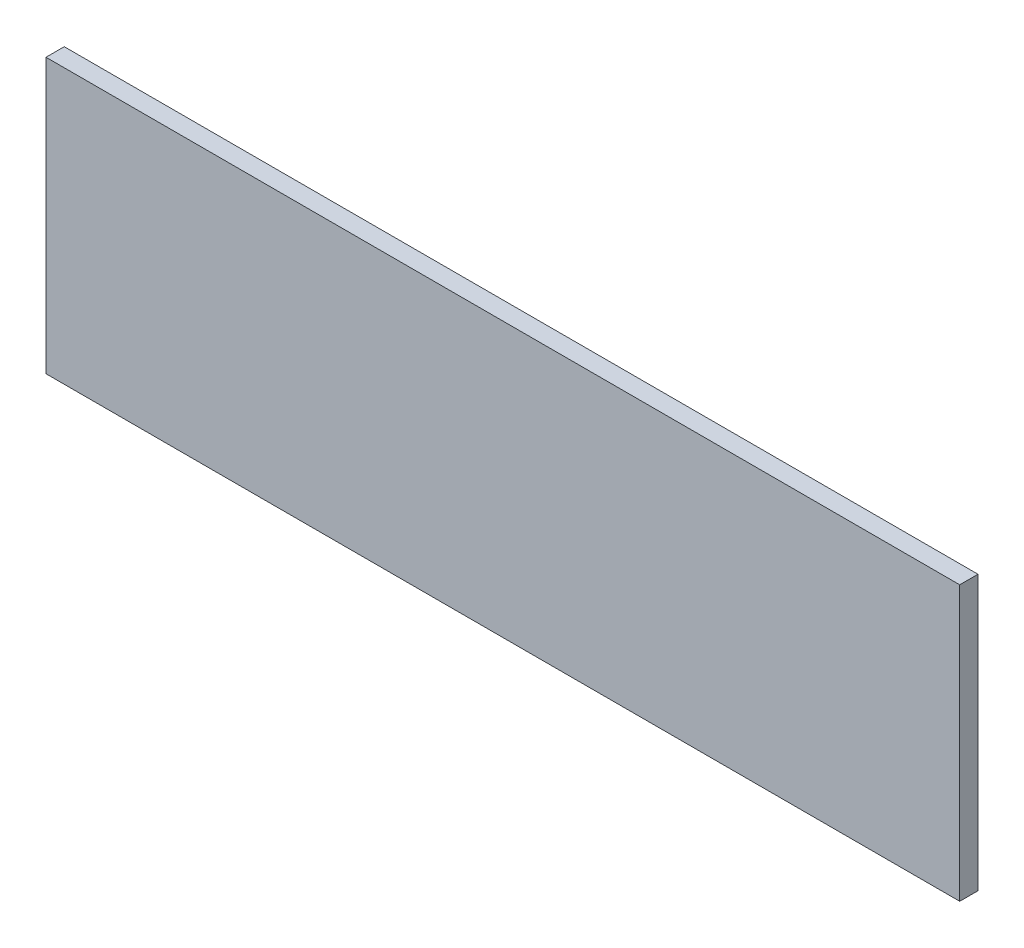
ISO-10303-21;
HEADER;
FILE_DESCRIPTION(('STEP AP214'),'2;1');
FILE_NAME('part.step','',(''),(''),'','','');
FILE_SCHEMA(('AUTOMOTIVE_DESIGN { 1 0 10303 214 1 1 1 1 }'));
ENDSEC;
DATA;
#1=APPLICATION_CONTEXT('core data for automotive mechanical design processes');
#2=APPLICATION_PROTOCOL_DEFINITION('international standard','automotive_design',2000,#1);
#3=PRODUCT_CONTEXT('',#1,'mechanical');
#4=PRODUCT('Part','Part','',(#3));
#5=PRODUCT_RELATED_PRODUCT_CATEGORY('part','',(#4));
#6=PRODUCT_DEFINITION_FORMATION('','',#4);
#7=PRODUCT_DEFINITION_CONTEXT('part definition',#1,'design');
#8=PRODUCT_DEFINITION('design','',#6,#7);
#9=PRODUCT_DEFINITION_SHAPE('','',#8);
#10=(LENGTH_UNIT() NAMED_UNIT(*) SI_UNIT(.MILLI.,.METRE.));
#11=(NAMED_UNIT(*) PLANE_ANGLE_UNIT() SI_UNIT($,.RADIAN.));
#12=(NAMED_UNIT(*) SI_UNIT($,.STERADIAN.) SOLID_ANGLE_UNIT());
#13=UNCERTAINTY_MEASURE_WITH_UNIT(LENGTH_MEASURE(1.E-05),#10,'distance_accuracy_value','');
#14=(GEOMETRIC_REPRESENTATION_CONTEXT(3) GLOBAL_UNCERTAINTY_ASSIGNED_CONTEXT((#13)) GLOBAL_UNIT_ASSIGNED_CONTEXT((#10,
#11,#12)) REPRESENTATION_CONTEXT('',''));
#15=CARTESIAN_POINT('',(0.,0.,0.));
#16=DIRECTION('',(0.,0.,1.));
#17=DIRECTION('',(1.,0.,0.));
#18=AXIS2_PLACEMENT_3D('',#15,#16,#17);
#19=CARTESIAN_POINT('',(-177.979274611399,94.041450777202,10.));
#20=DIRECTION('',(1.,0.,0.));
#21=DIRECTION('',(0.,0.,-1.));
#22=AXIS2_PLACEMENT_3D('',#19,#20,#21);
#23=PLANE('',#22);
#24=DIRECTION('',(0.,-1.,0.));
#25=VECTOR('',#24,1.);
#26=CARTESIAN_POINT('',(-177.979274611399,94.041450777202,0.));
#27=LINE('',#26,#25);
#28=CARTESIAN_POINT('',(-177.979274611399,94.041450777202,0.));
#29=VERTEX_POINT('',#28);
#30=CARTESIAN_POINT('',(-177.979274611399,-55.9585492227979,0.));
#31=VERTEX_POINT('',#30);
#32=EDGE_CURVE('E99',#29,#31,#27,.T.);
#33=ORIENTED_EDGE('',*,*,#32,.T.);
#34=DIRECTION('',(0.,0.,-1.));
#35=VECTOR('',#34,1.);
#36=CARTESIAN_POINT('',(-177.979274611399,-55.9585492227979,10.));
#37=LINE('',#36,#35);
#38=CARTESIAN_POINT('',(-177.979274611399,-55.9585492227979,10.));
#39=VERTEX_POINT('',#38);
#40=EDGE_CURVE('E11',#39,#31,#37,.T.);
#41=ORIENTED_EDGE('',*,*,#40,.F.);
#42=DIRECTION('',(0.,-1.,0.));
#43=VECTOR('',#42,1.);
#44=CARTESIAN_POINT('',(-177.979274611399,94.041450777202,10.));
#45=LINE('',#44,#43);
#46=CARTESIAN_POINT('',(-177.979274611399,94.041450777202,10.));
#47=VERTEX_POINT('',#46);
#48=EDGE_CURVE('E87',#47,#39,#45,.T.);
#49=ORIENTED_EDGE('',*,*,#48,.F.);
#50=DIRECTION('',(0.,0.,-1.));
#51=VECTOR('',#50,1.);
#52=CARTESIAN_POINT('',(-177.979274611399,94.041450777202,10.));
#53=LINE('',#52,#51);
#54=EDGE_CURVE('E95',#47,#29,#53,.T.);
#55=ORIENTED_EDGE('',*,*,#54,.T.);
#56=EDGE_LOOP('',(#33,#41,#49,#55));
#57=FACE_BOUND('',#56,.T.);
#58=ADVANCED_FACE('F36',(#57),#23,.F.);
#59=CARTESIAN_POINT('',(-177.979274611399,-55.9585492227979,10.));
#60=DIRECTION('',(0.,1.,0.));
#61=DIRECTION('',(-1.,0.,0.));
#62=AXIS2_PLACEMENT_3D('',#59,#60,#61);
#63=PLANE('',#62);
#64=DIRECTION('',(1.,0.,0.));
#65=VECTOR('',#64,1.);
#66=CARTESIAN_POINT('',(-177.979274611399,-55.9585492227979,0.));
#67=LINE('',#66,#65);
#68=CARTESIAN_POINT('',(322.020725388601,-55.9585492227979,0.));
#69=VERTEX_POINT('',#68);
#70=EDGE_CURVE('E91',#31,#69,#67,.T.);
#71=ORIENTED_EDGE('',*,*,#70,.T.);
#72=DIRECTION('',(0.,0.,-1.));
#73=VECTOR('',#72,1.);
#74=CARTESIAN_POINT('',(322.020725388601,-55.9585492227979,10.));
#75=LINE('',#74,#73);
#76=CARTESIAN_POINT('',(322.020725388601,-55.9585492227979,10.));
#77=VERTEX_POINT('',#76);
#78=EDGE_CURVE('E44',#77,#69,#75,.T.);
#79=ORIENTED_EDGE('',*,*,#78,.F.);
#80=DIRECTION('',(1.,0.,0.));
#81=VECTOR('',#80,1.);
#82=CARTESIAN_POINT('',(-177.979274611399,-55.9585492227979,10.));
#83=LINE('',#82,#81);
#84=EDGE_CURVE('E82',#39,#77,#83,.T.);
#85=ORIENTED_EDGE('',*,*,#84,.F.);
#86=ORIENTED_EDGE('',*,*,#40,.T.);
#87=EDGE_LOOP('',(#71,#79,#85,#86));
#88=FACE_BOUND('',#87,.T.);
#89=ADVANCED_FACE('F90',(#88),#63,.F.);
#90=CARTESIAN_POINT('',(322.020725388601,-55.9585492227979,10.));
#91=DIRECTION('',(-1.,0.,0.));
#92=DIRECTION('',(0.,0.,1.));
#93=AXIS2_PLACEMENT_3D('',#90,#91,#92);
#94=PLANE('',#93);
#95=DIRECTION('',(0.,1.,0.));
#96=VECTOR('',#95,1.);
#97=CARTESIAN_POINT('',(322.020725388601,-55.9585492227979,0.));
#98=LINE('',#97,#96);
#99=CARTESIAN_POINT('',(322.020725388601,94.0414507772021,0.));
#100=VERTEX_POINT('',#99);
#101=EDGE_CURVE('E69',#69,#100,#98,.T.);
#102=ORIENTED_EDGE('',*,*,#101,.T.);
#103=DIRECTION('',(0.,0.,-1.));
#104=VECTOR('',#103,1.);
#105=CARTESIAN_POINT('',(322.020725388601,94.0414507772021,10.));
#106=LINE('',#105,#104);
#107=CARTESIAN_POINT('',(322.020725388601,94.0414507772021,10.));
#108=VERTEX_POINT('',#107);
#109=EDGE_CURVE('E92',#108,#100,#106,.T.);
#110=ORIENTED_EDGE('',*,*,#109,.F.);
#111=DIRECTION('',(0.,1.,0.));
#112=VECTOR('',#111,1.);
#113=CARTESIAN_POINT('',(322.020725388601,-55.9585492227979,10.));
#114=LINE('',#113,#112);
#115=EDGE_CURVE('E85',#77,#108,#114,.T.);
#116=ORIENTED_EDGE('',*,*,#115,.F.);
#117=ORIENTED_EDGE('',*,*,#78,.T.);
#118=EDGE_LOOP('',(#102,#110,#116,#117));
#119=FACE_BOUND('',#118,.T.);
#120=ADVANCED_FACE('F93',(#119),#94,.F.);
#121=CARTESIAN_POINT('',(322.020725388601,94.0414507772021,10.));
#122=DIRECTION('',(0.,-1.,0.));
#123=DIRECTION('',(1.,0.,0.));
#124=AXIS2_PLACEMENT_3D('',#121,#122,#123);
#125=PLANE('',#124);
#126=DIRECTION('',(-1.,0.,0.));
#127=VECTOR('',#126,1.);
#128=CARTESIAN_POINT('',(322.020725388601,94.0414507772021,0.));
#129=LINE('',#128,#127);
#130=EDGE_CURVE('E75',#100,#29,#129,.T.);
#131=ORIENTED_EDGE('',*,*,#130,.T.);
#132=ORIENTED_EDGE('',*,*,#54,.F.);
#133=DIRECTION('',(-1.,0.,0.));
#134=VECTOR('',#133,1.);
#135=CARTESIAN_POINT('',(322.020725388601,94.0414507772021,10.));
#136=LINE('',#135,#134);
#137=EDGE_CURVE('E52',#108,#47,#136,.T.);
#138=ORIENTED_EDGE('',*,*,#137,.F.);
#139=ORIENTED_EDGE('',*,*,#109,.T.);
#140=EDGE_LOOP('',(#131,#132,#138,#139));
#141=FACE_BOUND('',#140,.T.);
#142=ADVANCED_FACE('F106',(#141),#125,.F.);
#143=CARTESIAN_POINT('',(0.,0.,10.));
#144=DIRECTION('',(0.,0.,1.));
#145=DIRECTION('',(1.,0.,0.));
#146=AXIS2_PLACEMENT_3D('',#143,#144,#145);
#147=PLANE('',#146);
#148=ORIENTED_EDGE('',*,*,#48,.T.);
#149=ORIENTED_EDGE('',*,*,#84,.T.);
#150=ORIENTED_EDGE('',*,*,#115,.T.);
#151=ORIENTED_EDGE('',*,*,#137,.T.);
#152=EDGE_LOOP('',(#148,#149,#150,#151));
#153=FACE_BOUND('',#152,.T.);
#154=ADVANCED_FACE('F83',(#153),#147,.T.);
#155=CARTESIAN_POINT('',(0.,0.,0.));
#156=DIRECTION('',(0.,0.,1.));
#157=DIRECTION('',(1.,0.,0.));
#158=AXIS2_PLACEMENT_3D('',#155,#156,#157);
#159=PLANE('',#158);
#160=ORIENTED_EDGE('',*,*,#32,.F.);
#161=ORIENTED_EDGE('',*,*,#130,.F.);
#162=ORIENTED_EDGE('',*,*,#101,.F.);
#163=ORIENTED_EDGE('',*,*,#70,.F.);
#164=EDGE_LOOP('',(#160,#161,#162,#163));
#165=FACE_BOUND('',#164,.T.);
#166=ADVANCED_FACE('F109',(#165),#159,.F.);
#167=CLOSED_SHELL('',(#58,#89,#120,#142,#154,#166));
#168=MANIFOLD_SOLID_BREP('B2',#167);
#169=ADVANCED_BREP_SHAPE_REPRESENTATION('',(#18,#168),#14);
#170=SHAPE_DEFINITION_REPRESENTATION(#9,#169);
ENDSEC;
END-ISO-10303-21;
